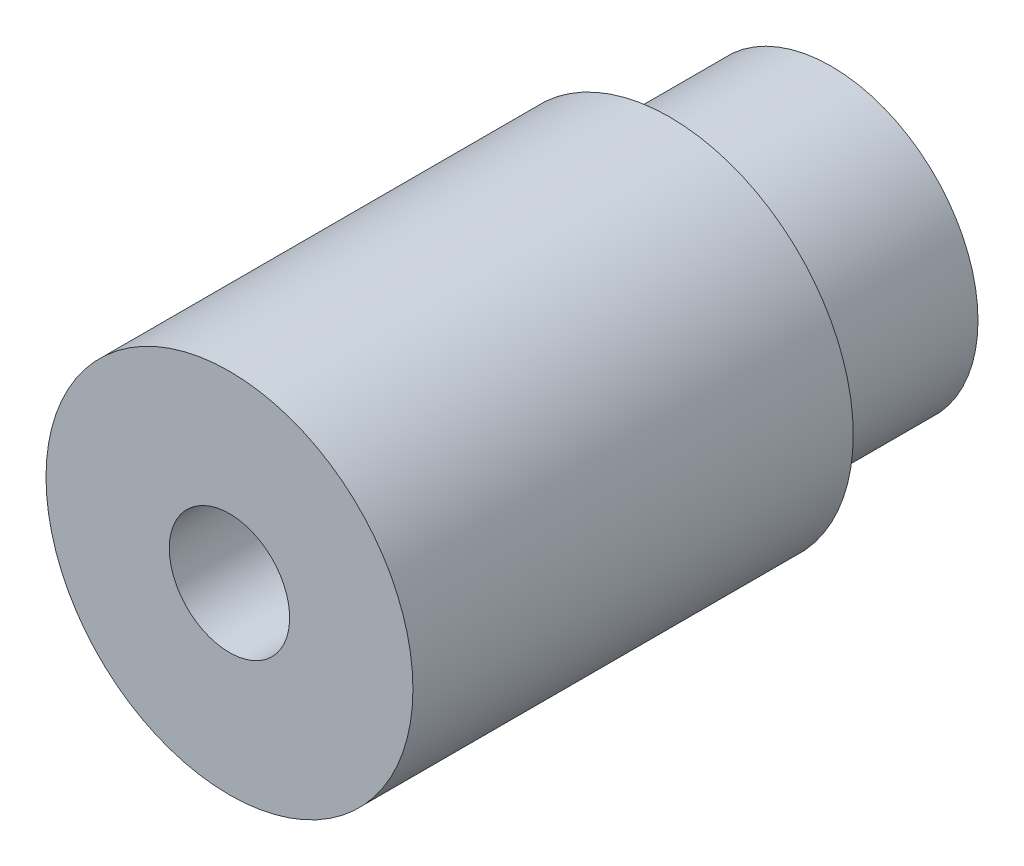
ISO-10303-21;
HEADER;
FILE_DESCRIPTION(('STEP AP214'),'2;1');
FILE_NAME('part.step','',(''),(''),'','','');
FILE_SCHEMA(('AUTOMOTIVE_DESIGN { 1 0 10303 214 1 1 1 1 }'));
ENDSEC;
DATA;
#1=APPLICATION_CONTEXT('core data for automotive mechanical design processes');
#2=APPLICATION_PROTOCOL_DEFINITION('international standard','automotive_design',2000,#1);
#3=PRODUCT_CONTEXT('',#1,'mechanical');
#4=PRODUCT('Part','Part','',(#3));
#5=PRODUCT_RELATED_PRODUCT_CATEGORY('part','',(#4));
#6=PRODUCT_DEFINITION_FORMATION('','',#4);
#7=PRODUCT_DEFINITION_CONTEXT('part definition',#1,'design');
#8=PRODUCT_DEFINITION('design','',#6,#7);
#9=PRODUCT_DEFINITION_SHAPE('','',#8);
#10=(LENGTH_UNIT() NAMED_UNIT(*) SI_UNIT(.MILLI.,.METRE.));
#11=(NAMED_UNIT(*) PLANE_ANGLE_UNIT() SI_UNIT($,.RADIAN.));
#12=(NAMED_UNIT(*) SI_UNIT($,.STERADIAN.) SOLID_ANGLE_UNIT());
#13=UNCERTAINTY_MEASURE_WITH_UNIT(LENGTH_MEASURE(1.E-05),#10,'distance_accuracy_value','');
#14=(GEOMETRIC_REPRESENTATION_CONTEXT(3) GLOBAL_UNCERTAINTY_ASSIGNED_CONTEXT((#13)) GLOBAL_UNIT_ASSIGNED_CONTEXT((#10,
#11,#12)) REPRESENTATION_CONTEXT('',''));
#15=CARTESIAN_POINT('',(0.,0.,0.));
#16=DIRECTION('',(0.,0.,1.));
#17=DIRECTION('',(1.,0.,0.));
#18=AXIS2_PLACEMENT_3D('',#15,#16,#17);
#19=CARTESIAN_POINT('',(25.,-300.,-30.));
#20=DIRECTION('',(0.,0.,1.));
#21=DIRECTION('',(1.,0.,0.));
#22=AXIS2_PLACEMENT_3D('',#19,#20,#21);
#23=PLANE('',#22);
#24=CARTESIAN_POINT('',(25.,-300.,-30.));
#25=DIRECTION('',(0.,0.,1.));
#26=DIRECTION('',(1.,0.,0.));
#27=AXIS2_PLACEMENT_3D('',#24,#25,#26);
#28=CIRCLE('',#27,12.5);
#29=CARTESIAN_POINT('',(37.5,-300.,-30.));
#30=VERTEX_POINT('',#29);
#31=EDGE_CURVE('E43',#30,#30,#28,.T.);
#32=ORIENTED_EDGE('',*,*,#31,.F.);
#33=EDGE_LOOP('',(#32));
#34=FACE_BOUND('',#33,.T.);
#35=CARTESIAN_POINT('',(25.,-300.,-30.));
#36=DIRECTION('',(0.,0.,1.));
#37=DIRECTION('',(1.,0.,0.));
#38=AXIS2_PLACEMENT_3D('',#35,#36,#37);
#39=CIRCLE('',#38,10.);
#40=CARTESIAN_POINT('',(35.,-300.,-30.));
#41=VERTEX_POINT('',#40);
#42=EDGE_CURVE('E10',#41,#41,#39,.F.);
#43=ORIENTED_EDGE('',*,*,#42,.F.);
#44=EDGE_LOOP('',(#43));
#45=FACE_BOUND('',#44,.T.);
#46=ADVANCED_FACE('F36',(#34,#45),#23,.F.);
#47=CARTESIAN_POINT('',(25.,-300.,-30.));
#48=DIRECTION('',(0.,0.,1.));
#49=DIRECTION('',(1.,0.,0.));
#50=AXIS2_PLACEMENT_3D('',#47,#48,#49);
#51=CYLINDRICAL_SURFACE('',#50,12.5);
#52=ORIENTED_EDGE('',*,*,#31,.T.);
#53=EDGE_LOOP('',(#52));
#54=FACE_BOUND('',#53,.T.);
#55=CARTESIAN_POINT('',(25.,-300.,0.));
#56=DIRECTION('',(0.,0.,1.));
#57=DIRECTION('',(1.,0.,0.));
#58=AXIS2_PLACEMENT_3D('',#55,#56,#57);
#59=CIRCLE('',#58,12.5);
#60=CARTESIAN_POINT('',(37.5,-300.,0.));
#61=VERTEX_POINT('',#60);
#62=EDGE_CURVE('E47',#61,#61,#59,.T.);
#63=ORIENTED_EDGE('',*,*,#62,.F.);
#64=EDGE_LOOP('',(#63));
#65=FACE_BOUND('',#64,.T.);
#66=ADVANCED_FACE('F38',(#54,#65),#51,.T.);
#67=CARTESIAN_POINT('',(25.,-300.,0.));
#68=DIRECTION('',(0.,0.,1.));
#69=DIRECTION('',(1.,0.,0.));
#70=AXIS2_PLACEMENT_3D('',#67,#68,#69);
#71=PLANE('',#70);
#72=CARTESIAN_POINT('',(25.,-300.,0.));
#73=DIRECTION('',(0.,0.,-1.));
#74=DIRECTION('',(-1.,0.,0.));
#75=AXIS2_PLACEMENT_3D('',#72,#73,#74);
#76=CIRCLE('',#75,4.09999999999999);
#77=CARTESIAN_POINT('',(20.9,-300.,0.));
#78=VERTEX_POINT('',#77);
#79=EDGE_CURVE('E56',#78,#78,#76,.T.);
#80=ORIENTED_EDGE('',*,*,#79,.T.);
#81=EDGE_LOOP('',(#80));
#82=FACE_BOUND('',#81,.T.);
#83=ORIENTED_EDGE('',*,*,#62,.T.);
#84=EDGE_LOOP('',(#83));
#85=FACE_BOUND('',#84,.T.);
#86=ADVANCED_FACE('F63',(#82,#85),#71,.T.);
#87=CARTESIAN_POINT('',(25.,-300.,-41.));
#88=DIRECTION('',(0.,0.,1.));
#89=DIRECTION('',(1.,0.,0.));
#90=AXIS2_PLACEMENT_3D('',#87,#88,#89);
#91=CYLINDRICAL_SURFACE('',#90,10.);
#92=CARTESIAN_POINT('',(25.,-300.,-41.));
#93=DIRECTION('',(0.,0.,-1.));
#94=DIRECTION('',(-1.,0.,0.));
#95=AXIS2_PLACEMENT_3D('',#92,#93,#94);
#96=CIRCLE('',#95,10.);
#97=CARTESIAN_POINT('',(15.,-300.,-41.));
#98=VERTEX_POINT('',#97);
#99=EDGE_CURVE('E52',#98,#98,#96,.T.);
#100=ORIENTED_EDGE('',*,*,#99,.F.);
#101=EDGE_LOOP('',(#100));
#102=FACE_BOUND('',#101,.T.);
#103=ORIENTED_EDGE('',*,*,#42,.T.);
#104=EDGE_LOOP('',(#103));
#105=FACE_BOUND('',#104,.T.);
#106=ADVANCED_FACE('F75',(#102,#105),#91,.T.);
#107=CARTESIAN_POINT('',(25.,-300.,-41.));
#108=DIRECTION('',(0.,0.,-1.));
#109=DIRECTION('',(-1.,0.,0.));
#110=AXIS2_PLACEMENT_3D('',#107,#108,#109);
#111=PLANE('',#110);
#112=CARTESIAN_POINT('',(25.,-300.,-41.));
#113=DIRECTION('',(0.,0.,-1.));
#114=DIRECTION('',(-1.,0.,0.));
#115=AXIS2_PLACEMENT_3D('',#112,#113,#114);
#116=CIRCLE('',#115,4.09999999999999);
#117=CARTESIAN_POINT('',(20.9,-300.,-41.));
#118=VERTEX_POINT('',#117);
#119=EDGE_CURVE('E57',#118,#118,#116,.T.);
#120=ORIENTED_EDGE('',*,*,#119,.F.);
#121=EDGE_LOOP('',(#120));
#122=FACE_BOUND('',#121,.T.);
#123=ORIENTED_EDGE('',*,*,#99,.T.);
#124=EDGE_LOOP('',(#123));
#125=FACE_BOUND('',#124,.T.);
#126=ADVANCED_FACE('F69',(#122,#125),#111,.T.);
#127=CARTESIAN_POINT('',(25.,-300.,0.));
#128=DIRECTION('',(0.,0.,-1.));
#129=DIRECTION('',(-1.,0.,0.));
#130=AXIS2_PLACEMENT_3D('',#127,#128,#129);
#131=CYLINDRICAL_SURFACE('',#130,4.09999999999999);
#132=ORIENTED_EDGE('',*,*,#79,.F.);
#133=EDGE_LOOP('',(#132));
#134=FACE_BOUND('',#133,.T.);
#135=ORIENTED_EDGE('',*,*,#119,.T.);
#136=EDGE_LOOP('',(#135));
#137=FACE_BOUND('',#136,.T.);
#138=ADVANCED_FACE('F66',(#134,#137),#131,.F.);
#139=CLOSED_SHELL('',(#46,#66,#86,#106,#126,#138));
#140=MANIFOLD_SOLID_BREP('B2',#139);
#141=ADVANCED_BREP_SHAPE_REPRESENTATION('',(#18,#140),#14);
#142=SHAPE_DEFINITION_REPRESENTATION(#9,#141);
ENDSEC;
END-ISO-10303-21;
